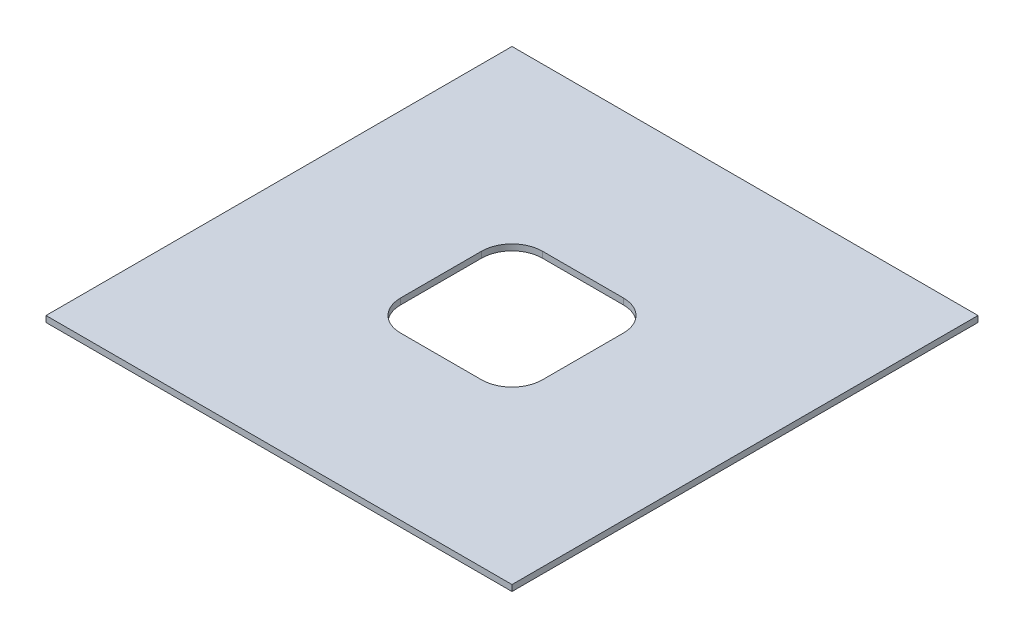
ISO-10303-21;
HEADER;
FILE_DESCRIPTION(('STEP AP214'),'2;1');
FILE_NAME('part.step','',(''),(''),'','','');
FILE_SCHEMA(('AUTOMOTIVE_DESIGN { 1 0 10303 214 1 1 1 1 }'));
ENDSEC;
DATA;
#1=APPLICATION_CONTEXT('core data for automotive mechanical design processes');
#2=APPLICATION_PROTOCOL_DEFINITION('international standard','automotive_design',2000,#1);
#3=PRODUCT_CONTEXT('',#1,'mechanical');
#4=PRODUCT('Part','Part','',(#3));
#5=PRODUCT_RELATED_PRODUCT_CATEGORY('part','',(#4));
#6=PRODUCT_DEFINITION_FORMATION('','',#4);
#7=PRODUCT_DEFINITION_CONTEXT('part definition',#1,'design');
#8=PRODUCT_DEFINITION('design','',#6,#7);
#9=PRODUCT_DEFINITION_SHAPE('','',#8);
#10=(LENGTH_UNIT() NAMED_UNIT(*) SI_UNIT(.MILLI.,.METRE.));
#11=(NAMED_UNIT(*) PLANE_ANGLE_UNIT() SI_UNIT($,.RADIAN.));
#12=(NAMED_UNIT(*) SI_UNIT($,.STERADIAN.) SOLID_ANGLE_UNIT());
#13=UNCERTAINTY_MEASURE_WITH_UNIT(LENGTH_MEASURE(1.E-05),#10,'distance_accuracy_value','');
#14=(GEOMETRIC_REPRESENTATION_CONTEXT(3) GLOBAL_UNCERTAINTY_ASSIGNED_CONTEXT((#13)) GLOBAL_UNIT_ASSIGNED_CONTEXT((#10,
#11,#12)) REPRESENTATION_CONTEXT('',''));
#15=CARTESIAN_POINT('',(0.,0.,0.));
#16=DIRECTION('',(0.,0.,1.));
#17=DIRECTION('',(1.,0.,0.));
#18=AXIS2_PLACEMENT_3D('',#15,#16,#17);
#19=CARTESIAN_POINT('',(0.,3.,0.));
#20=DIRECTION('',(0.,-1.,0.));
#21=DIRECTION('',(0.,0.,-1.));
#22=AXIS2_PLACEMENT_3D('',#19,#20,#21);
#23=PLANE('',#22);
#24=DIRECTION('',(0.,0.,1.));
#25=VECTOR('',#24,1.);
#26=CARTESIAN_POINT('',(-115.,3.,-115.));
#27=LINE('',#26,#25);
#28=CARTESIAN_POINT('',(-115.,3.,-115.));
#29=VERTEX_POINT('',#28);
#30=CARTESIAN_POINT('',(-115.,3.,115.));
#31=VERTEX_POINT('',#30);
#32=EDGE_CURVE('E218',#29,#31,#27,.T.);
#33=ORIENTED_EDGE('',*,*,#32,.T.);
#34=DIRECTION('',(1.,0.,0.));
#35=VECTOR('',#34,1.);
#36=CARTESIAN_POINT('',(115.,3.,115.));
#37=LINE('',#36,#35);
#38=CARTESIAN_POINT('',(115.,3.,115.));
#39=VERTEX_POINT('',#38);
#40=EDGE_CURVE('E222',#31,#39,#37,.T.);
#41=ORIENTED_EDGE('',*,*,#40,.T.);
#42=DIRECTION('',(0.,0.,-1.));
#43=VECTOR('',#42,1.);
#44=CARTESIAN_POINT('',(115.,3.,-115.));
#45=LINE('',#44,#43);
#46=CARTESIAN_POINT('',(115.,3.,-115.));
#47=VERTEX_POINT('',#46);
#48=EDGE_CURVE('E226',#39,#47,#45,.T.);
#49=ORIENTED_EDGE('',*,*,#48,.T.);
#50=DIRECTION('',(-1.,0.,0.));
#51=VECTOR('',#50,1.);
#52=CARTESIAN_POINT('',(115.,3.,-115.));
#53=LINE('',#52,#51);
#54=EDGE_CURVE('E229',#47,#29,#53,.T.);
#55=ORIENTED_EDGE('',*,*,#54,.T.);
#56=EDGE_LOOP('',(#33,#41,#49,#55));
#57=FACE_BOUND('',#56,.T.);
#58=CARTESIAN_POINT('',(-20.,3.,-20.));
#59=DIRECTION('',(0.,1.,0.));
#60=DIRECTION('',(0.,0.,1.));
#61=AXIS2_PLACEMENT_3D('',#58,#59,#60);
#62=CIRCLE('',#61,15.);
#63=CARTESIAN_POINT('',(-19.9999999999999,3.,-35.));
#64=VERTEX_POINT('',#63);
#65=CARTESIAN_POINT('',(-35.,3.,-19.9999999999999));
#66=VERTEX_POINT('',#65);
#67=EDGE_CURVE('E129',#64,#66,#62,.T.);
#68=ORIENTED_EDGE('',*,*,#67,.F.);
#69=DIRECTION('',(-1.,0.,0.));
#70=VECTOR('',#69,1.);
#71=CARTESIAN_POINT('',(-19.9999999999999,3.,-35.));
#72=LINE('',#71,#70);
#73=CARTESIAN_POINT('',(19.9999999999999,3.,-35.));
#74=VERTEX_POINT('',#73);
#75=EDGE_CURVE('E170',#74,#64,#72,.T.);
#76=ORIENTED_EDGE('',*,*,#75,.F.);
#77=CARTESIAN_POINT('',(20.,3.,-20.));
#78=DIRECTION('',(0.,1.,0.));
#79=DIRECTION('',(0.,0.,-1.));
#80=AXIS2_PLACEMENT_3D('',#77,#78,#79);
#81=CIRCLE('',#80,15.);
#82=CARTESIAN_POINT('',(35.,3.,-19.9999999999999));
#83=VERTEX_POINT('',#82);
#84=EDGE_CURVE('E167',#83,#74,#81,.T.);
#85=ORIENTED_EDGE('',*,*,#84,.F.);
#86=DIRECTION('',(0.,0.,-1.));
#87=VECTOR('',#86,1.);
#88=CARTESIAN_POINT('',(35.,3.,19.9999999999999));
#89=LINE('',#88,#87);
#90=CARTESIAN_POINT('',(35.,3.,19.9999999999999));
#91=VERTEX_POINT('',#90);
#92=EDGE_CURVE('E164',#91,#83,#89,.T.);
#93=ORIENTED_EDGE('',*,*,#92,.F.);
#94=CARTESIAN_POINT('',(20.,3.,20.0000000000001));
#95=DIRECTION('',(0.,1.,0.));
#96=DIRECTION('',(0.,0.,-1.));
#97=AXIS2_PLACEMENT_3D('',#94,#95,#96);
#98=CIRCLE('',#97,15.);
#99=CARTESIAN_POINT('',(19.9999999999999,3.,35.));
#100=VERTEX_POINT('',#99);
#101=EDGE_CURVE('E161',#100,#91,#98,.T.);
#102=ORIENTED_EDGE('',*,*,#101,.F.);
#103=DIRECTION('',(1.,0.,0.));
#104=VECTOR('',#103,1.);
#105=CARTESIAN_POINT('',(-19.9999999999999,3.,35.));
#106=LINE('',#105,#104);
#107=CARTESIAN_POINT('',(-19.9999999999999,3.,35.));
#108=VERTEX_POINT('',#107);
#109=EDGE_CURVE('E156',#108,#100,#106,.T.);
#110=ORIENTED_EDGE('',*,*,#109,.F.);
#111=CARTESIAN_POINT('',(-20.,3.,20.0000000000001));
#112=DIRECTION('',(0.,1.,0.));
#113=DIRECTION('',(0.,0.,-1.));
#114=AXIS2_PLACEMENT_3D('',#111,#112,#113);
#115=CIRCLE('',#114,15.);
#116=CARTESIAN_POINT('',(-35.,3.,19.9999999999999));
#117=VERTEX_POINT('',#116);
#118=EDGE_CURVE('E152',#117,#108,#115,.T.);
#119=ORIENTED_EDGE('',*,*,#118,.F.);
#120=DIRECTION('',(0.,0.,1.));
#121=VECTOR('',#120,1.);
#122=CARTESIAN_POINT('',(-35.,3.,19.9999999999999));
#123=LINE('',#122,#121);
#124=EDGE_CURVE('E138',#66,#117,#123,.T.);
#125=ORIENTED_EDGE('',*,*,#124,.F.);
#126=EDGE_LOOP('',(#68,#76,#85,#93,#102,#110,#119,#125));
#127=FACE_BOUND('',#126,.T.);
#128=ADVANCED_FACE('F39',(#57,#127),#23,.F.);
#129=CARTESIAN_POINT('',(0.,0.,0.));
#130=DIRECTION('',(0.,-1.,0.));
#131=DIRECTION('',(0.,0.,-1.));
#132=AXIS2_PLACEMENT_3D('',#129,#130,#131);
#133=PLANE('',#132);
#134=DIRECTION('',(0.,0.,1.));
#135=VECTOR('',#134,1.);
#136=CARTESIAN_POINT('',(-115.,0.,-115.));
#137=LINE('',#136,#135);
#138=CARTESIAN_POINT('',(-115.,0.,-115.));
#139=VERTEX_POINT('',#138);
#140=CARTESIAN_POINT('',(-115.,0.,115.));
#141=VERTEX_POINT('',#140);
#142=EDGE_CURVE('E147',#139,#141,#137,.T.);
#143=ORIENTED_EDGE('',*,*,#142,.F.);
#144=DIRECTION('',(-1.,0.,0.));
#145=VECTOR('',#144,1.);
#146=CARTESIAN_POINT('',(115.,0.,-115.));
#147=LINE('',#146,#145);
#148=CARTESIAN_POINT('',(115.,0.,-115.));
#149=VERTEX_POINT('',#148);
#150=EDGE_CURVE('E223',#149,#139,#147,.T.);
#151=ORIENTED_EDGE('',*,*,#150,.F.);
#152=DIRECTION('',(0.,0.,-1.));
#153=VECTOR('',#152,1.);
#154=CARTESIAN_POINT('',(115.,0.,-115.));
#155=LINE('',#154,#153);
#156=CARTESIAN_POINT('',(115.,0.,115.));
#157=VERTEX_POINT('',#156);
#158=EDGE_CURVE('E239',#157,#149,#155,.T.);
#159=ORIENTED_EDGE('',*,*,#158,.F.);
#160=DIRECTION('',(1.,0.,0.));
#161=VECTOR('',#160,1.);
#162=CARTESIAN_POINT('',(115.,0.,115.));
#163=LINE('',#162,#161);
#164=EDGE_CURVE('E236',#141,#157,#163,.T.);
#165=ORIENTED_EDGE('',*,*,#164,.F.);
#166=EDGE_LOOP('',(#143,#151,#159,#165));
#167=FACE_BOUND('',#166,.T.);
#168=DIRECTION('',(-1.,0.,0.));
#169=VECTOR('',#168,1.);
#170=CARTESIAN_POINT('',(-19.9999999999999,0.,-35.));
#171=LINE('',#170,#169);
#172=CARTESIAN_POINT('',(19.9999999999999,0.,-35.));
#173=VERTEX_POINT('',#172);
#174=CARTESIAN_POINT('',(-19.9999999999999,0.,-35.));
#175=VERTEX_POINT('',#174);
#176=EDGE_CURVE('E139',#173,#175,#171,.T.);
#177=ORIENTED_EDGE('',*,*,#176,.T.);
#178=CARTESIAN_POINT('',(-20.,0.,-20.));
#179=DIRECTION('',(0.,1.,0.));
#180=DIRECTION('',(0.,0.,1.));
#181=AXIS2_PLACEMENT_3D('',#178,#179,#180);
#182=CIRCLE('',#181,15.);
#183=CARTESIAN_POINT('',(-35.,0.,-19.9999999999999));
#184=VERTEX_POINT('',#183);
#185=EDGE_CURVE('E63',#175,#184,#182,.T.);
#186=ORIENTED_EDGE('',*,*,#185,.T.);
#187=DIRECTION('',(0.,0.,1.));
#188=VECTOR('',#187,1.);
#189=CARTESIAN_POINT('',(-35.,0.,19.9999999999999));
#190=LINE('',#189,#188);
#191=CARTESIAN_POINT('',(-35.,0.,19.9999999999999));
#192=VERTEX_POINT('',#191);
#193=EDGE_CURVE('E145',#184,#192,#190,.T.);
#194=ORIENTED_EDGE('',*,*,#193,.T.);
#195=CARTESIAN_POINT('',(-20.,0.,20.0000000000001));
#196=DIRECTION('',(0.,1.,0.));
#197=DIRECTION('',(0.,0.,-1.));
#198=AXIS2_PLACEMENT_3D('',#195,#196,#197);
#199=CIRCLE('',#198,15.);
#200=CARTESIAN_POINT('',(-19.9999999999999,0.,35.));
#201=VERTEX_POINT('',#200);
#202=EDGE_CURVE('E177',#192,#201,#199,.T.);
#203=ORIENTED_EDGE('',*,*,#202,.T.);
#204=DIRECTION('',(1.,0.,0.));
#205=VECTOR('',#204,1.);
#206=CARTESIAN_POINT('',(-19.9999999999999,0.,35.));
#207=LINE('',#206,#205);
#208=CARTESIAN_POINT('',(19.9999999999999,0.,35.));
#209=VERTEX_POINT('',#208);
#210=EDGE_CURVE('E181',#201,#209,#207,.T.);
#211=ORIENTED_EDGE('',*,*,#210,.T.);
#212=CARTESIAN_POINT('',(20.,0.,20.0000000000001));
#213=DIRECTION('',(0.,1.,0.));
#214=DIRECTION('',(0.,0.,-1.));
#215=AXIS2_PLACEMENT_3D('',#212,#213,#214);
#216=CIRCLE('',#215,15.);
#217=CARTESIAN_POINT('',(35.,0.,19.9999999999999));
#218=VERTEX_POINT('',#217);
#219=EDGE_CURVE('E185',#209,#218,#216,.T.);
#220=ORIENTED_EDGE('',*,*,#219,.T.);
#221=DIRECTION('',(0.,0.,-1.));
#222=VECTOR('',#221,1.);
#223=CARTESIAN_POINT('',(35.,0.,19.9999999999999));
#224=LINE('',#223,#222);
#225=CARTESIAN_POINT('',(35.,0.,-19.9999999999999));
#226=VERTEX_POINT('',#225);
#227=EDGE_CURVE('E189',#218,#226,#224,.T.);
#228=ORIENTED_EDGE('',*,*,#227,.T.);
#229=CARTESIAN_POINT('',(20.,0.,-20.));
#230=DIRECTION('',(0.,1.,0.));
#231=DIRECTION('',(0.,0.,-1.));
#232=AXIS2_PLACEMENT_3D('',#229,#230,#231);
#233=CIRCLE('',#232,15.);
#234=EDGE_CURVE('E193',#226,#173,#233,.T.);
#235=ORIENTED_EDGE('',*,*,#234,.T.);
#236=EDGE_LOOP('',(#177,#186,#194,#203,#211,#220,#228,#235));
#237=FACE_BOUND('',#236,.T.);
#238=ADVANCED_FACE('F262',(#167,#237),#133,.T.);
#239=CARTESIAN_POINT('',(-115.,3.,-115.));
#240=DIRECTION('',(1.,0.,0.));
#241=DIRECTION('',(0.,0.,-1.));
#242=AXIS2_PLACEMENT_3D('',#239,#240,#241);
#243=PLANE('',#242);
#244=ORIENTED_EDGE('',*,*,#142,.T.);
#245=DIRECTION('',(0.,-1.,0.));
#246=VECTOR('',#245,1.);
#247=CARTESIAN_POINT('',(-115.,3.,115.));
#248=LINE('',#247,#246);
#249=EDGE_CURVE('E11',#31,#141,#248,.T.);
#250=ORIENTED_EDGE('',*,*,#249,.F.);
#251=ORIENTED_EDGE('',*,*,#32,.F.);
#252=DIRECTION('',(0.,-1.,0.));
#253=VECTOR('',#252,1.);
#254=CARTESIAN_POINT('',(-115.,3.,-115.));
#255=LINE('',#254,#253);
#256=EDGE_CURVE('E232',#29,#139,#255,.T.);
#257=ORIENTED_EDGE('',*,*,#256,.T.);
#258=EDGE_LOOP('',(#244,#250,#251,#257));
#259=FACE_BOUND('',#258,.T.);
#260=ADVANCED_FACE('F41',(#259),#243,.F.);
#261=CARTESIAN_POINT('',(115.,3.,115.));
#262=DIRECTION('',(0.,0.,-1.));
#263=DIRECTION('',(-1.,0.,0.));
#264=AXIS2_PLACEMENT_3D('',#261,#262,#263);
#265=PLANE('',#264);
#266=ORIENTED_EDGE('',*,*,#164,.T.);
#267=DIRECTION('',(0.,-1.,0.));
#268=VECTOR('',#267,1.);
#269=CARTESIAN_POINT('',(115.,3.,115.));
#270=LINE('',#269,#268);
#271=EDGE_CURVE('E48',#39,#157,#270,.T.);
#272=ORIENTED_EDGE('',*,*,#271,.F.);
#273=ORIENTED_EDGE('',*,*,#40,.F.);
#274=ORIENTED_EDGE('',*,*,#249,.T.);
#275=EDGE_LOOP('',(#266,#272,#273,#274));
#276=FACE_BOUND('',#275,.T.);
#277=ADVANCED_FACE('F272',(#276),#265,.F.);
#278=CARTESIAN_POINT('',(115.,3.,-115.));
#279=DIRECTION('',(-1.,0.,0.));
#280=DIRECTION('',(0.,0.,1.));
#281=AXIS2_PLACEMENT_3D('',#278,#279,#280);
#282=PLANE('',#281);
#283=ORIENTED_EDGE('',*,*,#158,.T.);
#284=DIRECTION('',(0.,-1.,0.));
#285=VECTOR('',#284,1.);
#286=CARTESIAN_POINT('',(115.,3.,-115.));
#287=LINE('',#286,#285);
#288=EDGE_CURVE('E247',#47,#149,#287,.T.);
#289=ORIENTED_EDGE('',*,*,#288,.F.);
#290=ORIENTED_EDGE('',*,*,#48,.F.);
#291=ORIENTED_EDGE('',*,*,#271,.T.);
#292=EDGE_LOOP('',(#283,#289,#290,#291));
#293=FACE_BOUND('',#292,.T.);
#294=ADVANCED_FACE('F256',(#293),#282,.F.);
#295=CARTESIAN_POINT('',(115.,3.,-115.));
#296=DIRECTION('',(0.,0.,1.));
#297=DIRECTION('',(1.,0.,0.));
#298=AXIS2_PLACEMENT_3D('',#295,#296,#297);
#299=PLANE('',#298);
#300=ORIENTED_EDGE('',*,*,#150,.T.);
#301=ORIENTED_EDGE('',*,*,#256,.F.);
#302=ORIENTED_EDGE('',*,*,#54,.F.);
#303=ORIENTED_EDGE('',*,*,#288,.T.);
#304=EDGE_LOOP('',(#300,#301,#302,#303));
#305=FACE_BOUND('',#304,.T.);
#306=ADVANCED_FACE('F266',(#305),#299,.F.);
#307=CARTESIAN_POINT('',(-20.,3.,-20.));
#308=DIRECTION('',(0.,-1.,0.));
#309=DIRECTION('',(0.,0.,-1.));
#310=AXIS2_PLACEMENT_3D('',#307,#308,#309);
#311=CYLINDRICAL_SURFACE('',#310,15.);
#312=ORIENTED_EDGE('',*,*,#185,.F.);
#313=DIRECTION('',(0.,-1.,0.));
#314=VECTOR('',#313,1.);
#315=CARTESIAN_POINT('',(-19.9999999999999,3.,-35.));
#316=LINE('',#315,#314);
#317=EDGE_CURVE('E133',#64,#175,#316,.T.);
#318=ORIENTED_EDGE('',*,*,#317,.F.);
#319=ORIENTED_EDGE('',*,*,#67,.T.);
#320=DIRECTION('',(0.,-1.,0.));
#321=VECTOR('',#320,1.);
#322=CARTESIAN_POINT('',(-35.,3.,-19.9999999999999));
#323=LINE('',#322,#321);
#324=EDGE_CURVE('E132',#66,#184,#323,.T.);
#325=ORIENTED_EDGE('',*,*,#324,.T.);
#326=EDGE_LOOP('',(#312,#318,#319,#325));
#327=FACE_BOUND('',#326,.T.);
#328=ADVANCED_FACE('F131',(#327),#311,.F.);
#329=CARTESIAN_POINT('',(-35.,3.,19.9999999999999));
#330=DIRECTION('',(1.,0.,0.));
#331=DIRECTION('',(0.,0.,-1.));
#332=AXIS2_PLACEMENT_3D('',#329,#330,#331);
#333=PLANE('',#332);
#334=ORIENTED_EDGE('',*,*,#193,.F.);
#335=ORIENTED_EDGE('',*,*,#324,.F.);
#336=ORIENTED_EDGE('',*,*,#124,.T.);
#337=DIRECTION('',(0.,-1.,0.));
#338=VECTOR('',#337,1.);
#339=CARTESIAN_POINT('',(-35.,3.,19.9999999999999));
#340=LINE('',#339,#338);
#341=EDGE_CURVE('E148',#117,#192,#340,.T.);
#342=ORIENTED_EDGE('',*,*,#341,.T.);
#343=EDGE_LOOP('',(#334,#335,#336,#342));
#344=FACE_BOUND('',#343,.T.);
#345=ADVANCED_FACE('F142',(#344),#333,.T.);
#346=CARTESIAN_POINT('',(-20.,3.,20.0000000000001));
#347=DIRECTION('',(0.,-1.,0.));
#348=DIRECTION('',(0.,0.,-1.));
#349=AXIS2_PLACEMENT_3D('',#346,#347,#348);
#350=CYLINDRICAL_SURFACE('',#349,15.);
#351=ORIENTED_EDGE('',*,*,#202,.F.);
#352=ORIENTED_EDGE('',*,*,#341,.F.);
#353=ORIENTED_EDGE('',*,*,#118,.T.);
#354=DIRECTION('',(0.,-1.,0.));
#355=VECTOR('',#354,1.);
#356=CARTESIAN_POINT('',(-19.9999999999999,3.,35.));
#357=LINE('',#356,#355);
#358=EDGE_CURVE('E213',#108,#201,#357,.T.);
#359=ORIENTED_EDGE('',*,*,#358,.T.);
#360=EDGE_LOOP('',(#351,#352,#353,#359));
#361=FACE_BOUND('',#360,.T.);
#362=ADVANCED_FACE('F295',(#361),#350,.F.);
#363=CARTESIAN_POINT('',(-19.9999999999999,3.,35.));
#364=DIRECTION('',(0.,0.,-1.));
#365=DIRECTION('',(-1.,0.,0.));
#366=AXIS2_PLACEMENT_3D('',#363,#364,#365);
#367=PLANE('',#366);
#368=ORIENTED_EDGE('',*,*,#210,.F.);
#369=ORIENTED_EDGE('',*,*,#358,.F.);
#370=ORIENTED_EDGE('',*,*,#109,.T.);
#371=DIRECTION('',(0.,-1.,0.));
#372=VECTOR('',#371,1.);
#373=CARTESIAN_POINT('',(19.9999999999999,3.,35.));
#374=LINE('',#373,#372);
#375=EDGE_CURVE('E210',#100,#209,#374,.T.);
#376=ORIENTED_EDGE('',*,*,#375,.T.);
#377=EDGE_LOOP('',(#368,#369,#370,#376));
#378=FACE_BOUND('',#377,.T.);
#379=ADVANCED_FACE('F299',(#378),#367,.T.);
#380=CARTESIAN_POINT('',(20.,3.,20.0000000000001));
#381=DIRECTION('',(0.,-1.,0.));
#382=DIRECTION('',(0.,0.,-1.));
#383=AXIS2_PLACEMENT_3D('',#380,#381,#382);
#384=CYLINDRICAL_SURFACE('',#383,15.);
#385=ORIENTED_EDGE('',*,*,#219,.F.);
#386=ORIENTED_EDGE('',*,*,#375,.F.);
#387=ORIENTED_EDGE('',*,*,#101,.T.);
#388=DIRECTION('',(0.,-1.,0.));
#389=VECTOR('',#388,1.);
#390=CARTESIAN_POINT('',(35.,3.,19.9999999999999));
#391=LINE('',#390,#389);
#392=EDGE_CURVE('E207',#91,#218,#391,.T.);
#393=ORIENTED_EDGE('',*,*,#392,.T.);
#394=EDGE_LOOP('',(#385,#386,#387,#393));
#395=FACE_BOUND('',#394,.T.);
#396=ADVANCED_FACE('F305',(#395),#384,.F.);
#397=CARTESIAN_POINT('',(35.,3.,19.9999999999999));
#398=DIRECTION('',(-1.,0.,0.));
#399=DIRECTION('',(0.,0.,1.));
#400=AXIS2_PLACEMENT_3D('',#397,#398,#399);
#401=PLANE('',#400);
#402=ORIENTED_EDGE('',*,*,#227,.F.);
#403=ORIENTED_EDGE('',*,*,#392,.F.);
#404=ORIENTED_EDGE('',*,*,#92,.T.);
#405=DIRECTION('',(0.,-1.,0.));
#406=VECTOR('',#405,1.);
#407=CARTESIAN_POINT('',(35.,3.,-19.9999999999999));
#408=LINE('',#407,#406);
#409=EDGE_CURVE('E204',#83,#226,#408,.T.);
#410=ORIENTED_EDGE('',*,*,#409,.T.);
#411=EDGE_LOOP('',(#402,#403,#404,#410));
#412=FACE_BOUND('',#411,.T.);
#413=ADVANCED_FACE('F309',(#412),#401,.T.);
#414=CARTESIAN_POINT('',(20.,3.,-20.));
#415=DIRECTION('',(0.,-1.,0.));
#416=DIRECTION('',(0.,0.,-1.));
#417=AXIS2_PLACEMENT_3D('',#414,#415,#416);
#418=CYLINDRICAL_SURFACE('',#417,15.);
#419=ORIENTED_EDGE('',*,*,#234,.F.);
#420=ORIENTED_EDGE('',*,*,#409,.F.);
#421=ORIENTED_EDGE('',*,*,#84,.T.);
#422=DIRECTION('',(0.,-1.,0.));
#423=VECTOR('',#422,1.);
#424=CARTESIAN_POINT('',(19.9999999999999,3.,-35.));
#425=LINE('',#424,#423);
#426=EDGE_CURVE('E55',#74,#173,#425,.T.);
#427=ORIENTED_EDGE('',*,*,#426,.T.);
#428=EDGE_LOOP('',(#419,#420,#421,#427));
#429=FACE_BOUND('',#428,.T.);
#430=ADVANCED_FACE('F313',(#429),#418,.F.);
#431=CARTESIAN_POINT('',(-19.9999999999999,3.,-35.));
#432=DIRECTION('',(0.,0.,1.));
#433=DIRECTION('',(1.,0.,0.));
#434=AXIS2_PLACEMENT_3D('',#431,#432,#433);
#435=PLANE('',#434);
#436=ORIENTED_EDGE('',*,*,#176,.F.);
#437=ORIENTED_EDGE('',*,*,#426,.F.);
#438=ORIENTED_EDGE('',*,*,#75,.T.);
#439=ORIENTED_EDGE('',*,*,#317,.T.);
#440=EDGE_LOOP('',(#436,#437,#438,#439));
#441=FACE_BOUND('',#440,.T.);
#442=ADVANCED_FACE('F317',(#441),#435,.T.);
#443=CLOSED_SHELL('',(#128,#238,#260,#277,#294,#306,#328,#345,#362,#379,#396,#413,#430,#442));
#444=MANIFOLD_SOLID_BREP('B2',#443);
#445=ADVANCED_BREP_SHAPE_REPRESENTATION('',(#18,#444),#14);
#446=SHAPE_DEFINITION_REPRESENTATION(#9,#445);
ENDSEC;
END-ISO-10303-21;
